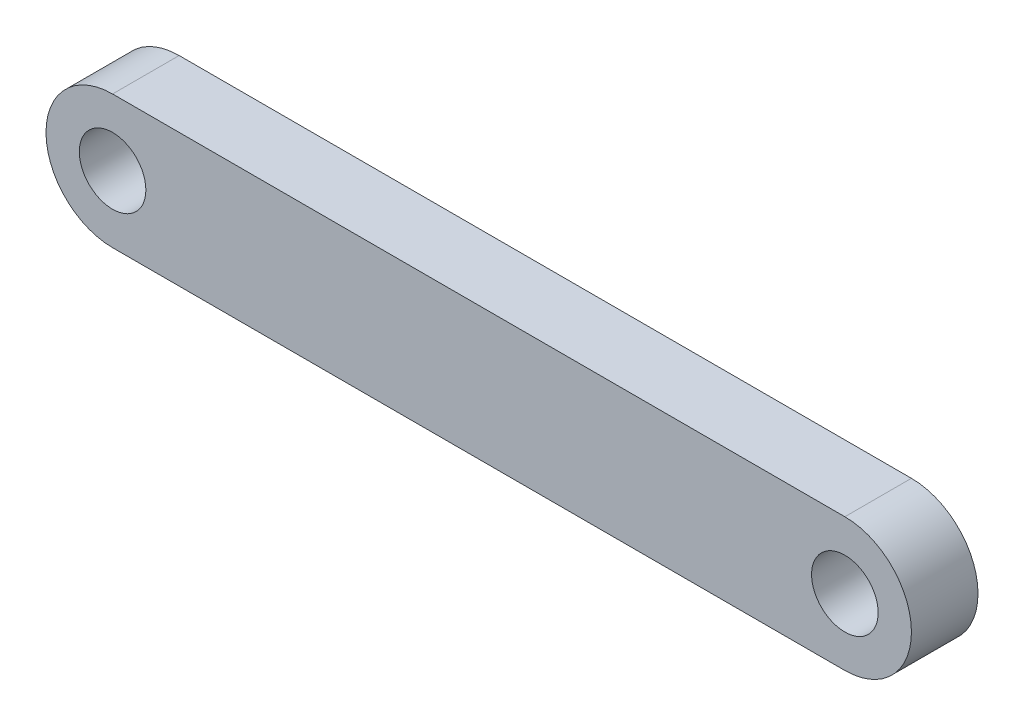
ISO-10303-21;
HEADER;
FILE_DESCRIPTION(('STEP AP214'),'2;1');
FILE_NAME('part.step','',(''),(''),'','','');
FILE_SCHEMA(('AUTOMOTIVE_DESIGN { 1 0 10303 214 1 1 1 1 }'));
ENDSEC;
DATA;
#1=APPLICATION_CONTEXT('core data for automotive mechanical design processes');
#2=APPLICATION_PROTOCOL_DEFINITION('international standard','automotive_design',2000,#1);
#3=PRODUCT_CONTEXT('',#1,'mechanical');
#4=PRODUCT('Part','Part','',(#3));
#5=PRODUCT_RELATED_PRODUCT_CATEGORY('part','',(#4));
#6=PRODUCT_DEFINITION_FORMATION('','',#4);
#7=PRODUCT_DEFINITION_CONTEXT('part definition',#1,'design');
#8=PRODUCT_DEFINITION('design','',#6,#7);
#9=PRODUCT_DEFINITION_SHAPE('','',#8);
#10=(LENGTH_UNIT() NAMED_UNIT(*) SI_UNIT(.MILLI.,.METRE.));
#11=(NAMED_UNIT(*) PLANE_ANGLE_UNIT() SI_UNIT($,.RADIAN.));
#12=(NAMED_UNIT(*) SI_UNIT($,.STERADIAN.) SOLID_ANGLE_UNIT());
#13=UNCERTAINTY_MEASURE_WITH_UNIT(LENGTH_MEASURE(1.E-05),#10,'distance_accuracy_value','');
#14=(GEOMETRIC_REPRESENTATION_CONTEXT(3) GLOBAL_UNCERTAINTY_ASSIGNED_CONTEXT((#13)) GLOBAL_UNIT_ASSIGNED_CONTEXT((#10,
#11,#12)) REPRESENTATION_CONTEXT('',''));
#15=CARTESIAN_POINT('',(0.,0.,0.));
#16=DIRECTION('',(0.,0.,1.));
#17=DIRECTION('',(1.,0.,0.));
#18=AXIS2_PLACEMENT_3D('',#15,#16,#17);
#19=CARTESIAN_POINT('',(0.,0.,3.));
#20=DIRECTION('',(0.,0.,1.));
#21=DIRECTION('',(1.,0.,0.));
#22=AXIS2_PLACEMENT_3D('',#19,#20,#21);
#23=PLANE('',#22);
#24=CARTESIAN_POINT('',(0.,0.,3.));
#25=DIRECTION('',(0.,0.,1.));
#26=DIRECTION('',(1.,0.,0.));
#27=AXIS2_PLACEMENT_3D('',#24,#25,#26);
#28=CIRCLE('',#27,1.5);
#29=CARTESIAN_POINT('',(1.5,0.,3.));
#30=VERTEX_POINT('',#29);
#31=EDGE_CURVE('E99',#30,#30,#28,.T.);
#32=ORIENTED_EDGE('',*,*,#31,.F.);
#33=EDGE_LOOP('',(#32));
#34=FACE_BOUND('',#33,.T.);
#35=CARTESIAN_POINT('',(0.,0.,3.));
#36=DIRECTION('',(0.,0.,1.));
#37=DIRECTION('',(1.,0.,0.));
#38=AXIS2_PLACEMENT_3D('',#35,#36,#37);
#39=CIRCLE('',#38,3.);
#40=CARTESIAN_POINT('',(0.,3.,3.));
#41=VERTEX_POINT('',#40);
#42=CARTESIAN_POINT('',(0.,-3.,3.));
#43=VERTEX_POINT('',#42);
#44=EDGE_CURVE('E84',#41,#43,#39,.T.);
#45=ORIENTED_EDGE('',*,*,#44,.T.);
#46=DIRECTION('',(1.,0.,0.));
#47=VECTOR('',#46,1.);
#48=CARTESIAN_POINT('',(0.,-3.,3.));
#49=LINE('',#48,#47);
#50=CARTESIAN_POINT('',(33.,-3.,3.));
#51=VERTEX_POINT('',#50);
#52=EDGE_CURVE('E79',#43,#51,#49,.T.);
#53=ORIENTED_EDGE('',*,*,#52,.T.);
#54=CARTESIAN_POINT('',(33.,0.,3.));
#55=DIRECTION('',(0.,0.,1.));
#56=DIRECTION('',(1.,0.,0.));
#57=AXIS2_PLACEMENT_3D('',#54,#55,#56);
#58=CIRCLE('',#57,3.);
#59=CARTESIAN_POINT('',(33.,3.,3.));
#60=VERTEX_POINT('',#59);
#61=EDGE_CURVE('E82',#51,#60,#58,.T.);
#62=ORIENTED_EDGE('',*,*,#61,.T.);
#63=DIRECTION('',(-1.,0.,0.));
#64=VECTOR('',#63,1.);
#65=CARTESIAN_POINT('',(0.,3.,3.));
#66=LINE('',#65,#64);
#67=EDGE_CURVE('E49',#60,#41,#66,.T.);
#68=ORIENTED_EDGE('',*,*,#67,.T.);
#69=EDGE_LOOP('',(#45,#53,#62,#68));
#70=FACE_BOUND('',#69,.T.);
#71=CARTESIAN_POINT('',(33.,0.,3.));
#72=DIRECTION('',(0.,0.,1.));
#73=DIRECTION('',(1.,0.,0.));
#74=AXIS2_PLACEMENT_3D('',#71,#72,#73);
#75=CIRCLE('',#74,1.5);
#76=CARTESIAN_POINT('',(34.5,0.,3.));
#77=VERTEX_POINT('',#76);
#78=EDGE_CURVE('E114',#77,#77,#75,.T.);
#79=ORIENTED_EDGE('',*,*,#78,.F.);
#80=EDGE_LOOP('',(#79));
#81=FACE_BOUND('',#80,.T.);
#82=ADVANCED_FACE('F32',(#34,#70,#81),#23,.T.);
#83=CARTESIAN_POINT('',(0.,0.,0.));
#84=DIRECTION('',(0.,0.,1.));
#85=DIRECTION('',(1.,0.,0.));
#86=AXIS2_PLACEMENT_3D('',#83,#84,#85);
#87=PLANE('',#86);
#88=CARTESIAN_POINT('',(0.,0.,0.));
#89=DIRECTION('',(0.,0.,1.));
#90=DIRECTION('',(1.,0.,0.));
#91=AXIS2_PLACEMENT_3D('',#88,#89,#90);
#92=CIRCLE('',#91,3.);
#93=CARTESIAN_POINT('',(0.,3.,0.));
#94=VERTEX_POINT('',#93);
#95=CARTESIAN_POINT('',(0.,-3.,0.));
#96=VERTEX_POINT('',#95);
#97=EDGE_CURVE('E96',#94,#96,#92,.T.);
#98=ORIENTED_EDGE('',*,*,#97,.F.);
#99=DIRECTION('',(-1.,0.,0.));
#100=VECTOR('',#99,1.);
#101=CARTESIAN_POINT('',(0.,3.,0.));
#102=LINE('',#101,#100);
#103=CARTESIAN_POINT('',(33.,3.,0.));
#104=VERTEX_POINT('',#103);
#105=EDGE_CURVE('E72',#104,#94,#102,.T.);
#106=ORIENTED_EDGE('',*,*,#105,.F.);
#107=CARTESIAN_POINT('',(33.,0.,0.));
#108=DIRECTION('',(0.,0.,1.));
#109=DIRECTION('',(1.,0.,0.));
#110=AXIS2_PLACEMENT_3D('',#107,#108,#109);
#111=CIRCLE('',#110,3.);
#112=CARTESIAN_POINT('',(33.,-3.,0.));
#113=VERTEX_POINT('',#112);
#114=EDGE_CURVE('E66',#113,#104,#111,.T.);
#115=ORIENTED_EDGE('',*,*,#114,.F.);
#116=DIRECTION('',(1.,0.,0.));
#117=VECTOR('',#116,1.);
#118=CARTESIAN_POINT('',(0.,-3.,0.));
#119=LINE('',#118,#117);
#120=EDGE_CURVE('E88',#96,#113,#119,.T.);
#121=ORIENTED_EDGE('',*,*,#120,.F.);
#122=EDGE_LOOP('',(#98,#106,#115,#121));
#123=FACE_BOUND('',#122,.T.);
#124=CARTESIAN_POINT('',(0.,0.,0.));
#125=DIRECTION('',(0.,0.,1.));
#126=DIRECTION('',(1.,0.,0.));
#127=AXIS2_PLACEMENT_3D('',#124,#125,#126);
#128=CIRCLE('',#127,1.5);
#129=CARTESIAN_POINT('',(1.5,0.,0.));
#130=VERTEX_POINT('',#129);
#131=EDGE_CURVE('E111',#130,#130,#128,.T.);
#132=ORIENTED_EDGE('',*,*,#131,.T.);
#133=EDGE_LOOP('',(#132));
#134=FACE_BOUND('',#133,.T.);
#135=CARTESIAN_POINT('',(33.,0.,0.));
#136=DIRECTION('',(0.,0.,1.));
#137=DIRECTION('',(1.,0.,0.));
#138=AXIS2_PLACEMENT_3D('',#135,#136,#137);
#139=CIRCLE('',#138,1.5);
#140=CARTESIAN_POINT('',(34.5,0.,0.));
#141=VERTEX_POINT('',#140);
#142=EDGE_CURVE('E117',#141,#141,#139,.T.);
#143=ORIENTED_EDGE('',*,*,#142,.T.);
#144=EDGE_LOOP('',(#143));
#145=FACE_BOUND('',#144,.T.);
#146=ADVANCED_FACE('F107',(#123,#134,#145),#87,.F.);
#147=CARTESIAN_POINT('',(0.,0.,3.));
#148=DIRECTION('',(0.,0.,-1.));
#149=DIRECTION('',(-1.,0.,0.));
#150=AXIS2_PLACEMENT_3D('',#147,#148,#149);
#151=CYLINDRICAL_SURFACE('',#150,3.);
#152=ORIENTED_EDGE('',*,*,#97,.T.);
#153=DIRECTION('',(0.,0.,-1.));
#154=VECTOR('',#153,1.);
#155=CARTESIAN_POINT('',(0.,-3.,3.));
#156=LINE('',#155,#154);
#157=EDGE_CURVE('E11',#43,#96,#156,.T.);
#158=ORIENTED_EDGE('',*,*,#157,.F.);
#159=ORIENTED_EDGE('',*,*,#44,.F.);
#160=DIRECTION('',(0.,0.,-1.));
#161=VECTOR('',#160,1.);
#162=CARTESIAN_POINT('',(0.,3.,3.));
#163=LINE('',#162,#161);
#164=EDGE_CURVE('E92',#41,#94,#163,.T.);
#165=ORIENTED_EDGE('',*,*,#164,.T.);
#166=EDGE_LOOP('',(#152,#158,#159,#165));
#167=FACE_BOUND('',#166,.T.);
#168=ADVANCED_FACE('F34',(#167),#151,.T.);
#169=CARTESIAN_POINT('',(0.,-3.,3.));
#170=DIRECTION('',(0.,1.,0.));
#171=DIRECTION('',(0.,0.,1.));
#172=AXIS2_PLACEMENT_3D('',#169,#170,#171);
#173=PLANE('',#172);
#174=ORIENTED_EDGE('',*,*,#120,.T.);
#175=DIRECTION('',(0.,0.,-1.));
#176=VECTOR('',#175,1.);
#177=CARTESIAN_POINT('',(33.,-3.,3.));
#178=LINE('',#177,#176);
#179=EDGE_CURVE('E41',#51,#113,#178,.T.);
#180=ORIENTED_EDGE('',*,*,#179,.F.);
#181=ORIENTED_EDGE('',*,*,#52,.F.);
#182=ORIENTED_EDGE('',*,*,#157,.T.);
#183=EDGE_LOOP('',(#174,#180,#181,#182));
#184=FACE_BOUND('',#183,.T.);
#185=ADVANCED_FACE('F87',(#184),#173,.F.);
#186=CARTESIAN_POINT('',(33.,0.,3.));
#187=DIRECTION('',(0.,0.,-1.));
#188=DIRECTION('',(-1.,0.,0.));
#189=AXIS2_PLACEMENT_3D('',#186,#187,#188);
#190=CYLINDRICAL_SURFACE('',#189,3.);
#191=ORIENTED_EDGE('',*,*,#114,.T.);
#192=DIRECTION('',(0.,0.,-1.));
#193=VECTOR('',#192,1.);
#194=CARTESIAN_POINT('',(33.,3.,3.));
#195=LINE('',#194,#193);
#196=EDGE_CURVE('E89',#60,#104,#195,.T.);
#197=ORIENTED_EDGE('',*,*,#196,.F.);
#198=ORIENTED_EDGE('',*,*,#61,.F.);
#199=ORIENTED_EDGE('',*,*,#179,.T.);
#200=EDGE_LOOP('',(#191,#197,#198,#199));
#201=FACE_BOUND('',#200,.T.);
#202=ADVANCED_FACE('F90',(#201),#190,.T.);
#203=CARTESIAN_POINT('',(0.,3.,3.));
#204=DIRECTION('',(0.,-1.,0.));
#205=DIRECTION('',(0.,0.,-1.));
#206=AXIS2_PLACEMENT_3D('',#203,#204,#205);
#207=PLANE('',#206);
#208=ORIENTED_EDGE('',*,*,#105,.T.);
#209=ORIENTED_EDGE('',*,*,#164,.F.);
#210=ORIENTED_EDGE('',*,*,#67,.F.);
#211=ORIENTED_EDGE('',*,*,#196,.T.);
#212=EDGE_LOOP('',(#208,#209,#210,#211));
#213=FACE_BOUND('',#212,.T.);
#214=ADVANCED_FACE('F104',(#213),#207,.F.);
#215=CARTESIAN_POINT('',(0.,0.,3.));
#216=DIRECTION('',(0.,0.,-1.));
#217=DIRECTION('',(-1.,0.,0.));
#218=AXIS2_PLACEMENT_3D('',#215,#216,#217);
#219=CYLINDRICAL_SURFACE('',#218,1.5);
#220=ORIENTED_EDGE('',*,*,#31,.T.);
#221=EDGE_LOOP('',(#220));
#222=FACE_BOUND('',#221,.T.);
#223=ORIENTED_EDGE('',*,*,#131,.F.);
#224=EDGE_LOOP('',(#223));
#225=FACE_BOUND('',#224,.T.);
#226=ADVANCED_FACE('F134',(#222,#225),#219,.F.);
#227=CARTESIAN_POINT('',(33.,0.,3.));
#228=DIRECTION('',(0.,0.,-1.));
#229=DIRECTION('',(-1.,0.,0.));
#230=AXIS2_PLACEMENT_3D('',#227,#228,#229);
#231=CYLINDRICAL_SURFACE('',#230,1.5);
#232=ORIENTED_EDGE('',*,*,#78,.T.);
#233=EDGE_LOOP('',(#232));
#234=FACE_BOUND('',#233,.T.);
#235=ORIENTED_EDGE('',*,*,#142,.F.);
#236=EDGE_LOOP('',(#235));
#237=FACE_BOUND('',#236,.T.);
#238=ADVANCED_FACE('F123',(#234,#237),#231,.F.);
#239=CLOSED_SHELL('',(#82,#146,#168,#185,#202,#214,#226,#238));
#240=MANIFOLD_SOLID_BREP('B2',#239);
#241=ADVANCED_BREP_SHAPE_REPRESENTATION('',(#18,#240),#14);
#242=SHAPE_DEFINITION_REPRESENTATION(#9,#241);
ENDSEC;
END-ISO-10303-21;
